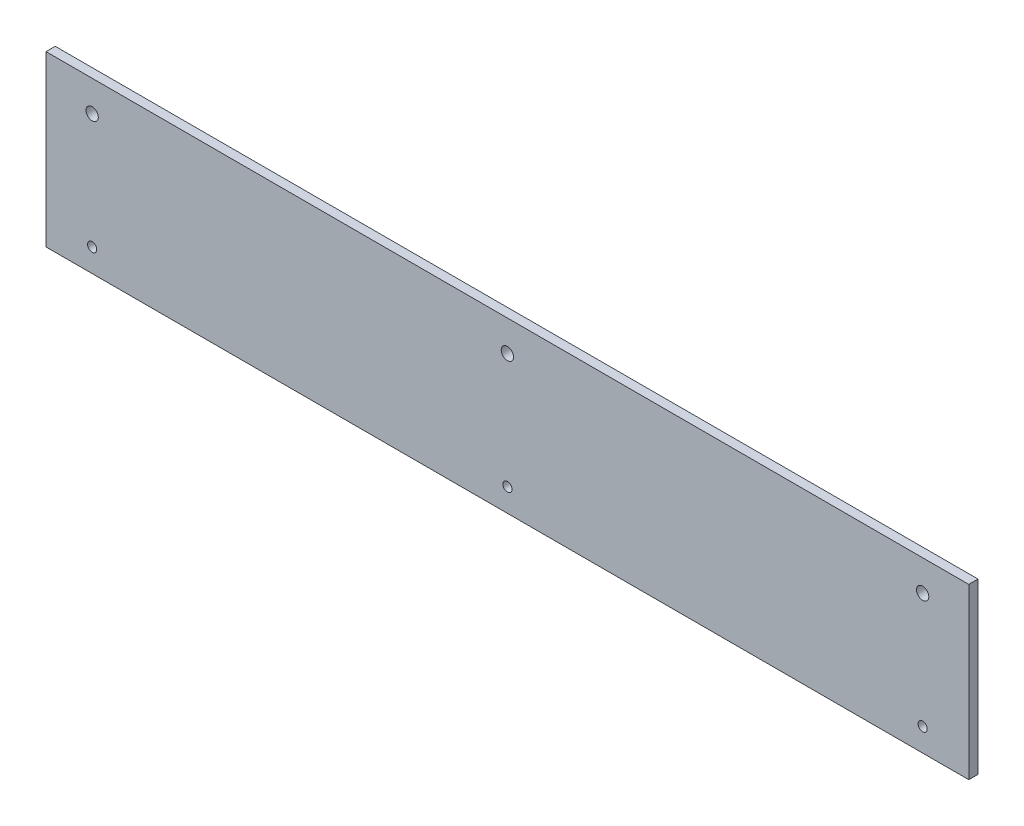
ISO-10303-21;
HEADER;
FILE_DESCRIPTION(('STEP AP214'),'2;1');
FILE_NAME('part.step','',(''),(''),'','','');
FILE_SCHEMA(('AUTOMOTIVE_DESIGN { 1 0 10303 214 1 1 1 1 }'));
ENDSEC;
DATA;
#1=APPLICATION_CONTEXT('core data for automotive mechanical design processes');
#2=APPLICATION_PROTOCOL_DEFINITION('international standard','automotive_design',2000,#1);
#3=PRODUCT_CONTEXT('',#1,'mechanical');
#4=PRODUCT('Part','Part','',(#3));
#5=PRODUCT_RELATED_PRODUCT_CATEGORY('part','',(#4));
#6=PRODUCT_DEFINITION_FORMATION('','',#4);
#7=PRODUCT_DEFINITION_CONTEXT('part definition',#1,'design');
#8=PRODUCT_DEFINITION('design','',#6,#7);
#9=PRODUCT_DEFINITION_SHAPE('','',#8);
#10=(LENGTH_UNIT() NAMED_UNIT(*) SI_UNIT(.MILLI.,.METRE.));
#11=(NAMED_UNIT(*) PLANE_ANGLE_UNIT() SI_UNIT($,.RADIAN.));
#12=(NAMED_UNIT(*) SI_UNIT($,.STERADIAN.) SOLID_ANGLE_UNIT());
#13=UNCERTAINTY_MEASURE_WITH_UNIT(LENGTH_MEASURE(1.E-05),#10,'distance_accuracy_value','');
#14=(GEOMETRIC_REPRESENTATION_CONTEXT(3) GLOBAL_UNCERTAINTY_ASSIGNED_CONTEXT((#13)) GLOBAL_UNIT_ASSIGNED_CONTEXT((#10,
#11,#12)) REPRESENTATION_CONTEXT('',''));
#15=CARTESIAN_POINT('',(0.,0.,0.));
#16=DIRECTION('',(0.,0.,1.));
#17=DIRECTION('',(1.,0.,0.));
#18=AXIS2_PLACEMENT_3D('',#15,#16,#17);
#19=CARTESIAN_POINT('',(0.,0.,3.));
#20=DIRECTION('',(-1.,0.,0.));
#21=DIRECTION('',(0.,0.,1.));
#22=AXIS2_PLACEMENT_3D('',#19,#20,#21);
#23=PLANE('',#22);
#24=DIRECTION('',(0.,1.,0.));
#25=VECTOR('',#24,1.);
#26=CARTESIAN_POINT('',(0.,0.,0.));
#27=LINE('',#26,#25);
#28=CARTESIAN_POINT('',(0.,0.,0.));
#29=VERTEX_POINT('',#28);
#30=CARTESIAN_POINT('',(0.,55.,0.));
#31=VERTEX_POINT('',#30);
#32=EDGE_CURVE('E121',#29,#31,#27,.T.);
#33=ORIENTED_EDGE('',*,*,#32,.F.);
#34=DIRECTION('',(0.,0.,-1.));
#35=VECTOR('',#34,1.);
#36=CARTESIAN_POINT('',(0.,0.,3.));
#37=LINE('',#36,#35);
#38=CARTESIAN_POINT('',(0.,0.,3.));
#39=VERTEX_POINT('',#38);
#40=EDGE_CURVE('E11',#39,#29,#37,.T.);
#41=ORIENTED_EDGE('',*,*,#40,.F.);
#42=DIRECTION('',(0.,1.,0.));
#43=VECTOR('',#42,1.);
#44=CARTESIAN_POINT('',(0.,0.,3.));
#45=LINE('',#44,#43);
#46=CARTESIAN_POINT('',(0.,55.,3.));
#47=VERTEX_POINT('',#46);
#48=EDGE_CURVE('E95',#39,#47,#45,.T.);
#49=ORIENTED_EDGE('',*,*,#48,.T.);
#50=DIRECTION('',(0.,0.,-1.));
#51=VECTOR('',#50,1.);
#52=CARTESIAN_POINT('',(0.,55.,3.));
#53=LINE('',#52,#51);
#54=EDGE_CURVE('E56',#47,#31,#53,.T.);
#55=ORIENTED_EDGE('',*,*,#54,.T.);
#56=EDGE_LOOP('',(#33,#41,#49,#55));
#57=FACE_BOUND('',#56,.T.);
#58=ADVANCED_FACE('F39',(#57),#23,.T.);
#59=CARTESIAN_POINT('',(0.,0.,3.));
#60=DIRECTION('',(0.,1.,0.));
#61=DIRECTION('',(0.,0.,1.));
#62=AXIS2_PLACEMENT_3D('',#59,#60,#61);
#63=PLANE('',#62);
#64=DIRECTION('',(1.,0.,0.));
#65=VECTOR('',#64,1.);
#66=CARTESIAN_POINT('',(0.,0.,0.));
#67=LINE('',#66,#65);
#68=CARTESIAN_POINT('',(300.,0.,0.));
#69=VERTEX_POINT('',#68);
#70=EDGE_CURVE('E100',#29,#69,#67,.T.);
#71=ORIENTED_EDGE('',*,*,#70,.T.);
#72=DIRECTION('',(0.,0.,-1.));
#73=VECTOR('',#72,1.);
#74=CARTESIAN_POINT('',(300.,0.,3.));
#75=LINE('',#74,#73);
#76=CARTESIAN_POINT('',(300.,0.,3.));
#77=VERTEX_POINT('',#76);
#78=EDGE_CURVE('E48',#77,#69,#75,.T.);
#79=ORIENTED_EDGE('',*,*,#78,.F.);
#80=DIRECTION('',(1.,0.,0.));
#81=VECTOR('',#80,1.);
#82=CARTESIAN_POINT('',(0.,0.,3.));
#83=LINE('',#82,#81);
#84=EDGE_CURVE('E90',#39,#77,#83,.T.);
#85=ORIENTED_EDGE('',*,*,#84,.F.);
#86=ORIENTED_EDGE('',*,*,#40,.T.);
#87=EDGE_LOOP('',(#71,#79,#85,#86));
#88=FACE_BOUND('',#87,.T.);
#89=ADVANCED_FACE('F98',(#88),#63,.F.);
#90=CARTESIAN_POINT('',(300.,0.,3.));
#91=DIRECTION('',(-1.,0.,0.));
#92=DIRECTION('',(0.,0.,1.));
#93=AXIS2_PLACEMENT_3D('',#90,#91,#92);
#94=PLANE('',#93);
#95=DIRECTION('',(0.,1.,0.));
#96=VECTOR('',#95,1.);
#97=CARTESIAN_POINT('',(300.,0.,0.));
#98=LINE('',#97,#96);
#99=CARTESIAN_POINT('',(300.,55.,0.));
#100=VERTEX_POINT('',#99);
#101=EDGE_CURVE('E118',#69,#100,#98,.T.);
#102=ORIENTED_EDGE('',*,*,#101,.T.);
#103=DIRECTION('',(0.,0.,-1.));
#104=VECTOR('',#103,1.);
#105=CARTESIAN_POINT('',(300.,55.,3.));
#106=LINE('',#105,#104);
#107=CARTESIAN_POINT('',(300.,55.,3.));
#108=VERTEX_POINT('',#107);
#109=EDGE_CURVE('E70',#108,#100,#106,.T.);
#110=ORIENTED_EDGE('',*,*,#109,.F.);
#111=DIRECTION('',(0.,1.,0.));
#112=VECTOR('',#111,1.);
#113=CARTESIAN_POINT('',(300.,0.,3.));
#114=LINE('',#113,#112);
#115=EDGE_CURVE('E82',#77,#108,#114,.T.);
#116=ORIENTED_EDGE('',*,*,#115,.F.);
#117=ORIENTED_EDGE('',*,*,#78,.T.);
#118=EDGE_LOOP('',(#102,#110,#116,#117));
#119=FACE_BOUND('',#118,.T.);
#120=ADVANCED_FACE('F84',(#119),#94,.F.);
#121=CARTESIAN_POINT('',(150.,7.5,3.));
#122=DIRECTION('',(0.,0.,-1.));
#123=DIRECTION('',(-1.,0.,0.));
#124=AXIS2_PLACEMENT_3D('',#121,#122,#123);
#125=CYLINDRICAL_SURFACE('',#124,1.5);
#126=CARTESIAN_POINT('',(150.,7.5,3.));
#127=DIRECTION('',(0.,0.,1.));
#128=DIRECTION('',(1.,0.,0.));
#129=AXIS2_PLACEMENT_3D('',#126,#127,#128);
#130=CIRCLE('',#129,1.5);
#131=CARTESIAN_POINT('',(151.5,7.5,3.));
#132=VERTEX_POINT('',#131);
#133=EDGE_CURVE('E134',#132,#132,#130,.T.);
#134=ORIENTED_EDGE('',*,*,#133,.T.);
#135=EDGE_LOOP('',(#134));
#136=FACE_BOUND('',#135,.T.);
#137=CARTESIAN_POINT('',(150.,7.5,0.));
#138=DIRECTION('',(0.,0.,1.));
#139=DIRECTION('',(1.,0.,0.));
#140=AXIS2_PLACEMENT_3D('',#137,#138,#139);
#141=CIRCLE('',#140,1.5);
#142=CARTESIAN_POINT('',(151.5,7.5,0.));
#143=VERTEX_POINT('',#142);
#144=EDGE_CURVE('E109',#143,#143,#141,.T.);
#145=ORIENTED_EDGE('',*,*,#144,.F.);
#146=EDGE_LOOP('',(#145));
#147=FACE_BOUND('',#146,.T.);
#148=ADVANCED_FACE('F265',(#136,#147),#125,.F.);
#149=CARTESIAN_POINT('',(285.,7.5,3.));
#150=DIRECTION('',(0.,0.,-1.));
#151=DIRECTION('',(-1.,0.,0.));
#152=AXIS2_PLACEMENT_3D('',#149,#150,#151);
#153=CYLINDRICAL_SURFACE('',#152,1.50000000000002);
#154=CARTESIAN_POINT('',(285.,7.5,3.));
#155=DIRECTION('',(0.,0.,1.));
#156=DIRECTION('',(1.,0.,0.));
#157=AXIS2_PLACEMENT_3D('',#154,#155,#156);
#158=CIRCLE('',#157,1.50000000000002);
#159=CARTESIAN_POINT('',(286.5,7.5,3.));
#160=VERTEX_POINT('',#159);
#161=EDGE_CURVE('E137',#160,#160,#158,.T.);
#162=ORIENTED_EDGE('',*,*,#161,.T.);
#163=EDGE_LOOP('',(#162));
#164=FACE_BOUND('',#163,.T.);
#165=CARTESIAN_POINT('',(285.,7.5,0.));
#166=DIRECTION('',(0.,0.,1.));
#167=DIRECTION('',(1.,0.,0.));
#168=AXIS2_PLACEMENT_3D('',#165,#166,#167);
#169=CIRCLE('',#168,1.50000000000002);
#170=CARTESIAN_POINT('',(286.5,7.5,0.));
#171=VERTEX_POINT('',#170);
#172=EDGE_CURVE('E112',#171,#171,#169,.T.);
#173=ORIENTED_EDGE('',*,*,#172,.F.);
#174=EDGE_LOOP('',(#173));
#175=FACE_BOUND('',#174,.T.);
#176=ADVANCED_FACE('F256',(#164,#175),#153,.F.);
#177=CARTESIAN_POINT('',(0.,55.,3.));
#178=DIRECTION('',(0.,1.,0.));
#179=DIRECTION('',(0.,0.,1.));
#180=AXIS2_PLACEMENT_3D('',#177,#178,#179);
#181=PLANE('',#180);
#182=DIRECTION('',(1.,0.,0.));
#183=VECTOR('',#182,1.);
#184=CARTESIAN_POINT('',(0.,55.,0.));
#185=LINE('',#184,#183);
#186=EDGE_CURVE('E115',#31,#100,#185,.T.);
#187=ORIENTED_EDGE('',*,*,#186,.F.);
#188=ORIENTED_EDGE('',*,*,#54,.F.);
#189=DIRECTION('',(1.,0.,0.));
#190=VECTOR('',#189,1.);
#191=CARTESIAN_POINT('',(0.,55.,3.));
#192=LINE('',#191,#190);
#193=EDGE_CURVE('E89',#47,#108,#192,.T.);
#194=ORIENTED_EDGE('',*,*,#193,.T.);
#195=ORIENTED_EDGE('',*,*,#109,.T.);
#196=EDGE_LOOP('',(#187,#188,#194,#195));
#197=FACE_BOUND('',#196,.T.);
#198=ADVANCED_FACE('F166',(#197),#181,.T.);
#199=CARTESIAN_POINT('',(15.,45.,3.));
#200=DIRECTION('',(0.,0.,-1.));
#201=DIRECTION('',(-1.,0.,0.));
#202=AXIS2_PLACEMENT_3D('',#199,#200,#201);
#203=CYLINDRICAL_SURFACE('',#202,2.);
#204=CARTESIAN_POINT('',(15.,45.,3.));
#205=DIRECTION('',(0.,0.,1.));
#206=DIRECTION('',(1.,0.,0.));
#207=AXIS2_PLACEMENT_3D('',#204,#205,#206);
#208=CIRCLE('',#207,2.);
#209=CARTESIAN_POINT('',(17.,45.,3.));
#210=VERTEX_POINT('',#209);
#211=EDGE_CURVE('E142',#210,#210,#208,.T.);
#212=ORIENTED_EDGE('',*,*,#211,.T.);
#213=EDGE_LOOP('',(#212));
#214=FACE_BOUND('',#213,.T.);
#215=CARTESIAN_POINT('',(15.,45.,0.));
#216=DIRECTION('',(0.,0.,1.));
#217=DIRECTION('',(1.,0.,0.));
#218=AXIS2_PLACEMENT_3D('',#215,#216,#217);
#219=CIRCLE('',#218,2.);
#220=CARTESIAN_POINT('',(17.,45.,0.));
#221=VERTEX_POINT('',#220);
#222=EDGE_CURVE('E123',#221,#221,#219,.T.);
#223=ORIENTED_EDGE('',*,*,#222,.F.);
#224=EDGE_LOOP('',(#223));
#225=FACE_BOUND('',#224,.T.);
#226=ADVANCED_FACE('F162',(#214,#225),#203,.F.);
#227=CARTESIAN_POINT('',(150.,45.,3.));
#228=DIRECTION('',(0.,0.,-1.));
#229=DIRECTION('',(-1.,0.,0.));
#230=AXIS2_PLACEMENT_3D('',#227,#228,#229);
#231=CYLINDRICAL_SURFACE('',#230,2.);
#232=CARTESIAN_POINT('',(150.,45.,3.));
#233=DIRECTION('',(0.,0.,1.));
#234=DIRECTION('',(1.,0.,0.));
#235=AXIS2_PLACEMENT_3D('',#232,#233,#234);
#236=CIRCLE('',#235,2.);
#237=CARTESIAN_POINT('',(152.,45.,3.));
#238=VERTEX_POINT('',#237);
#239=EDGE_CURVE('E145',#238,#238,#236,.T.);
#240=ORIENTED_EDGE('',*,*,#239,.T.);
#241=EDGE_LOOP('',(#240));
#242=FACE_BOUND('',#241,.T.);
#243=CARTESIAN_POINT('',(150.,45.,0.));
#244=DIRECTION('',(0.,0.,1.));
#245=DIRECTION('',(1.,0.,0.));
#246=AXIS2_PLACEMENT_3D('',#243,#244,#245);
#247=CIRCLE('',#246,2.);
#248=CARTESIAN_POINT('',(152.,45.,0.));
#249=VERTEX_POINT('',#248);
#250=EDGE_CURVE('E126',#249,#249,#247,.T.);
#251=ORIENTED_EDGE('',*,*,#250,.F.);
#252=EDGE_LOOP('',(#251));
#253=FACE_BOUND('',#252,.T.);
#254=ADVANCED_FACE('F165',(#242,#253),#231,.F.);
#255=CARTESIAN_POINT('',(285.,45.,3.));
#256=DIRECTION('',(0.,0.,-1.));
#257=DIRECTION('',(-1.,0.,0.));
#258=AXIS2_PLACEMENT_3D('',#255,#256,#257);
#259=CYLINDRICAL_SURFACE('',#258,2.);
#260=CARTESIAN_POINT('',(285.,45.,3.));
#261=DIRECTION('',(0.,0.,1.));
#262=DIRECTION('',(1.,0.,0.));
#263=AXIS2_PLACEMENT_3D('',#260,#261,#262);
#264=CIRCLE('',#263,2.);
#265=CARTESIAN_POINT('',(287.,45.,3.));
#266=VERTEX_POINT('',#265);
#267=EDGE_CURVE('E108',#266,#266,#264,.T.);
#268=ORIENTED_EDGE('',*,*,#267,.T.);
#269=EDGE_LOOP('',(#268));
#270=FACE_BOUND('',#269,.T.);
#271=CARTESIAN_POINT('',(285.,45.,0.));
#272=DIRECTION('',(0.,0.,1.));
#273=DIRECTION('',(1.,0.,0.));
#274=AXIS2_PLACEMENT_3D('',#271,#272,#273);
#275=CIRCLE('',#274,2.);
#276=CARTESIAN_POINT('',(287.,45.,0.));
#277=VERTEX_POINT('',#276);
#278=EDGE_CURVE('E129',#277,#277,#275,.T.);
#279=ORIENTED_EDGE('',*,*,#278,.F.);
#280=EDGE_LOOP('',(#279));
#281=FACE_BOUND('',#280,.T.);
#282=ADVANCED_FACE('F41',(#270,#281),#259,.F.);
#283=CARTESIAN_POINT('',(15.,7.5,3.));
#284=DIRECTION('',(0.,0.,-1.));
#285=DIRECTION('',(-1.,0.,0.));
#286=AXIS2_PLACEMENT_3D('',#283,#284,#285);
#287=CYLINDRICAL_SURFACE('',#286,1.5);
#288=CARTESIAN_POINT('',(15.,7.5,3.));
#289=DIRECTION('',(0.,0.,1.));
#290=DIRECTION('',(1.,0.,0.));
#291=AXIS2_PLACEMENT_3D('',#288,#289,#290);
#292=CIRCLE('',#291,1.5);
#293=CARTESIAN_POINT('',(16.5,7.5,3.));
#294=VERTEX_POINT('',#293);
#295=EDGE_CURVE('E104',#294,#294,#292,.T.);
#296=ORIENTED_EDGE('',*,*,#295,.T.);
#297=EDGE_LOOP('',(#296));
#298=FACE_BOUND('',#297,.T.);
#299=CARTESIAN_POINT('',(15.,7.5,0.));
#300=DIRECTION('',(0.,0.,1.));
#301=DIRECTION('',(1.,0.,0.));
#302=AXIS2_PLACEMENT_3D('',#299,#300,#301);
#303=CIRCLE('',#302,1.5);
#304=CARTESIAN_POINT('',(16.5,7.5,0.));
#305=VERTEX_POINT('',#304);
#306=EDGE_CURVE('E105',#305,#305,#303,.T.);
#307=ORIENTED_EDGE('',*,*,#306,.F.);
#308=EDGE_LOOP('',(#307));
#309=FACE_BOUND('',#308,.T.);
#310=ADVANCED_FACE('F156',(#298,#309),#287,.F.);
#311=CARTESIAN_POINT('',(0.,0.,3.));
#312=DIRECTION('',(0.,0.,1.));
#313=DIRECTION('',(1.,0.,0.));
#314=AXIS2_PLACEMENT_3D('',#311,#312,#313);
#315=PLANE('',#314);
#316=ORIENTED_EDGE('',*,*,#267,.F.);
#317=EDGE_LOOP('',(#316));
#318=FACE_BOUND('',#317,.T.);
#319=ORIENTED_EDGE('',*,*,#239,.F.);
#320=EDGE_LOOP('',(#319));
#321=FACE_BOUND('',#320,.T.);
#322=ORIENTED_EDGE('',*,*,#211,.F.);
#323=EDGE_LOOP('',(#322));
#324=FACE_BOUND('',#323,.T.);
#325=ORIENTED_EDGE('',*,*,#48,.F.);
#326=ORIENTED_EDGE('',*,*,#84,.T.);
#327=ORIENTED_EDGE('',*,*,#115,.T.);
#328=ORIENTED_EDGE('',*,*,#193,.F.);
#329=EDGE_LOOP('',(#325,#326,#327,#328));
#330=FACE_BOUND('',#329,.T.);
#331=ORIENTED_EDGE('',*,*,#161,.F.);
#332=EDGE_LOOP('',(#331));
#333=FACE_BOUND('',#332,.T.);
#334=ORIENTED_EDGE('',*,*,#133,.F.);
#335=EDGE_LOOP('',(#334));
#336=FACE_BOUND('',#335,.T.);
#337=ORIENTED_EDGE('',*,*,#295,.F.);
#338=EDGE_LOOP('',(#337));
#339=FACE_BOUND('',#338,.T.);
#340=ADVANCED_FACE('F93',(#318,#321,#324,#330,#333,#336,#339),#315,.T.);
#341=CARTESIAN_POINT('',(0.,0.,0.));
#342=DIRECTION('',(0.,0.,1.));
#343=DIRECTION('',(1.,0.,0.));
#344=AXIS2_PLACEMENT_3D('',#341,#342,#343);
#345=PLANE('',#344);
#346=ORIENTED_EDGE('',*,*,#278,.T.);
#347=EDGE_LOOP('',(#346));
#348=FACE_BOUND('',#347,.T.);
#349=ORIENTED_EDGE('',*,*,#250,.T.);
#350=EDGE_LOOP('',(#349));
#351=FACE_BOUND('',#350,.T.);
#352=ORIENTED_EDGE('',*,*,#222,.T.);
#353=EDGE_LOOP('',(#352));
#354=FACE_BOUND('',#353,.T.);
#355=ORIENTED_EDGE('',*,*,#32,.T.);
#356=ORIENTED_EDGE('',*,*,#186,.T.);
#357=ORIENTED_EDGE('',*,*,#101,.F.);
#358=ORIENTED_EDGE('',*,*,#70,.F.);
#359=EDGE_LOOP('',(#355,#356,#357,#358));
#360=FACE_BOUND('',#359,.T.);
#361=ORIENTED_EDGE('',*,*,#172,.T.);
#362=EDGE_LOOP('',(#361));
#363=FACE_BOUND('',#362,.T.);
#364=ORIENTED_EDGE('',*,*,#144,.T.);
#365=EDGE_LOOP('',(#364));
#366=FACE_BOUND('',#365,.T.);
#367=ORIENTED_EDGE('',*,*,#306,.T.);
#368=EDGE_LOOP('',(#367));
#369=FACE_BOUND('',#368,.T.);
#370=ADVANCED_FACE('F155',(#348,#351,#354,#360,#363,#366,#369),#345,.F.);
#371=CLOSED_SHELL('',(#58,#89,#120,#148,#176,#198,#226,#254,#282,#310,#340,#370));
#372=MANIFOLD_SOLID_BREP('B2',#371);
#373=ADVANCED_BREP_SHAPE_REPRESENTATION('',(#18,#372),#14);
#374=SHAPE_DEFINITION_REPRESENTATION(#9,#373);
ENDSEC;
END-ISO-10303-21;
